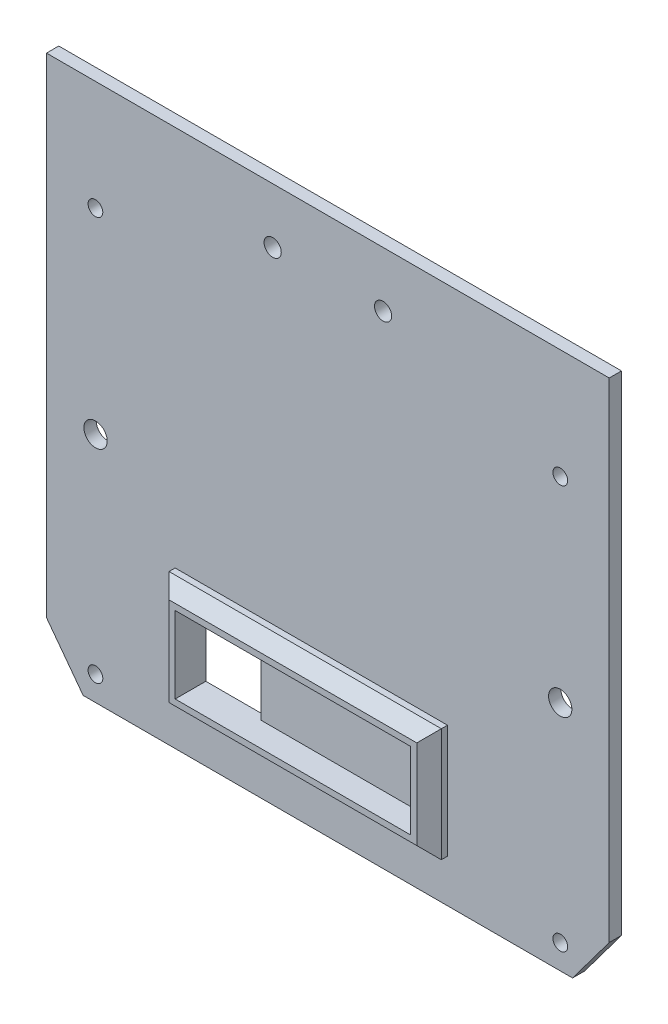
ISO-10303-21;
HEADER;
FILE_DESCRIPTION(('STEP AP214'),'2;1');
FILE_NAME('part.step','',(''),(''),'','','');
FILE_SCHEMA(('AUTOMOTIVE_DESIGN { 1 0 10303 214 1 1 1 1 }'));
ENDSEC;
DATA;
#1=APPLICATION_CONTEXT('core data for automotive mechanical design processes');
#2=APPLICATION_PROTOCOL_DEFINITION('international standard','automotive_design',2000,#1);
#3=PRODUCT_CONTEXT('',#1,'mechanical');
#4=PRODUCT('Part','Part','',(#3));
#5=PRODUCT_RELATED_PRODUCT_CATEGORY('part','',(#4));
#6=PRODUCT_DEFINITION_FORMATION('','',#4);
#7=PRODUCT_DEFINITION_CONTEXT('part definition',#1,'design');
#8=PRODUCT_DEFINITION('design','',#6,#7);
#9=PRODUCT_DEFINITION_SHAPE('','',#8);
#10=(LENGTH_UNIT() NAMED_UNIT(*) SI_UNIT(.MILLI.,.METRE.));
#11=(NAMED_UNIT(*) PLANE_ANGLE_UNIT() SI_UNIT($,.RADIAN.));
#12=(NAMED_UNIT(*) SI_UNIT($,.STERADIAN.) SOLID_ANGLE_UNIT());
#13=UNCERTAINTY_MEASURE_WITH_UNIT(LENGTH_MEASURE(1.E-05),#10,'distance_accuracy_value','');
#14=(GEOMETRIC_REPRESENTATION_CONTEXT(3) GLOBAL_UNCERTAINTY_ASSIGNED_CONTEXT((#13)) GLOBAL_UNIT_ASSIGNED_CONTEXT((#10,
#11,#12)) REPRESENTATION_CONTEXT('',''));
#15=CARTESIAN_POINT('',(0.,0.,0.));
#16=DIRECTION('',(0.,0.,1.));
#17=DIRECTION('',(1.,0.,0.));
#18=AXIS2_PLACEMENT_3D('',#15,#16,#17);
#19=CARTESIAN_POINT('',(0.,0.,1.));
#20=DIRECTION('',(0.,0.,1.));
#21=DIRECTION('',(1.,0.,0.));
#22=AXIS2_PLACEMENT_3D('',#19,#20,#21);
#23=PLANE('',#22);
#24=DIRECTION('',(1.,0.,0.));
#25=VECTOR('',#24,1.);
#26=CARTESIAN_POINT('',(0.,-27.1199999999979,1.));
#27=LINE('',#26,#25);
#28=CARTESIAN_POINT('',(-40.6299999999621,-27.1199999999979,1.));
#29=VERTEX_POINT('',#28);
#30=CARTESIAN_POINT('',(-12.2299999999621,-27.1199999999979,1.));
#31=VERTEX_POINT('',#30);
#32=EDGE_CURVE('E323',#29,#31,#27,.T.);
#33=ORIENTED_EDGE('',*,*,#32,.F.);
#34=DIRECTION('',(0.,-1.,0.));
#35=VECTOR('',#34,1.);
#36=CARTESIAN_POINT('',(-40.6299999999621,0.,1.));
#37=LINE('',#36,#35);
#38=CARTESIAN_POINT('',(-40.6299999999621,-39.6199999999979,1.));
#39=VERTEX_POINT('',#38);
#40=EDGE_CURVE('E300',#29,#39,#37,.T.);
#41=ORIENTED_EDGE('',*,*,#40,.T.);
#42=DIRECTION('',(1.,0.,0.));
#43=VECTOR('',#42,1.);
#44=CARTESIAN_POINT('',(0.,-39.6199999999979,1.));
#45=LINE('',#44,#43);
#46=CARTESIAN_POINT('',(-12.2299999999621,-39.6199999999979,1.));
#47=VERTEX_POINT('',#46);
#48=EDGE_CURVE('E328',#39,#47,#45,.T.);
#49=ORIENTED_EDGE('',*,*,#48,.T.);
#50=DIRECTION('',(0.,-1.,0.));
#51=VECTOR('',#50,1.);
#52=CARTESIAN_POINT('',(-12.2299999999621,0.,1.));
#53=LINE('',#52,#51);
#54=EDGE_CURVE('E331',#31,#47,#53,.T.);
#55=ORIENTED_EDGE('',*,*,#54,.F.);
#56=EDGE_LOOP('',(#33,#41,#49,#55));
#57=FACE_BOUND('',#56,.T.);
#58=ADVANCED_FACE('F47',(#57),#23,.T.);
#59=CARTESIAN_POINT('',(0.,0.,0.));
#60=DIRECTION('',(0.,0.,1.));
#61=DIRECTION('',(1.,0.,0.));
#62=AXIS2_PLACEMENT_3D('',#59,#60,#61);
#63=PLANE('',#62);
#64=CARTESIAN_POINT('',(-66.6099999999618,-11.7463143833101,0.));
#65=DIRECTION('',(0.,0.,-1.));
#66=DIRECTION('',(-1.,0.,0.));
#67=AXIS2_PLACEMENT_3D('',#64,#65,#66);
#68=CIRCLE('',#67,1.89999999999999);
#69=CARTESIAN_POINT('',(-68.5099999999618,-11.7463143833101,0.));
#70=VERTEX_POINT('',#69);
#71=EDGE_CURVE('E430',#70,#70,#68,.T.);
#72=ORIENTED_EDGE('',*,*,#71,.F.);
#73=EDGE_LOOP('',(#72));
#74=FACE_BOUND('',#73,.T.);
#75=CARTESIAN_POINT('',(9.15649160417692,-11.7463143833104,0.));
#76=DIRECTION('',(0.,0.,-1.));
#77=DIRECTION('',(-1.,0.,0.));
#78=AXIS2_PLACEMENT_3D('',#75,#76,#77);
#79=CIRCLE('',#78,1.9);
#80=CARTESIAN_POINT('',(7.25649160417692,-11.7463143833104,0.));
#81=VERTEX_POINT('',#80);
#82=EDGE_CURVE('E435',#81,#81,#79,.T.);
#83=ORIENTED_EDGE('',*,*,#82,.F.);
#84=EDGE_LOOP('',(#83));
#85=FACE_BOUND('',#84,.T.);
#86=DIRECTION('',(-1.,0.,0.));
#87=VECTOR('',#86,1.);
#88=CARTESIAN_POINT('',(1.32185928869475E-13,38.1000000000003,0.));
#89=LINE('',#88,#87);
#90=CARTESIAN_POINT('',(17.1500000000381,38.1000000000003,0.));
#91=VERTEX_POINT('',#90);
#92=CARTESIAN_POINT('',(-74.6099999999618,38.1000000000003,0.));
#93=VERTEX_POINT('',#92);
#94=EDGE_CURVE('E386',#91,#93,#89,.T.);
#95=ORIENTED_EDGE('',*,*,#94,.F.);
#96=DIRECTION('',(0.,1.,0.));
#97=VECTOR('',#96,1.);
#98=CARTESIAN_POINT('',(17.1500000000381,0.,0.));
#99=LINE('',#98,#97);
#100=CARTESIAN_POINT('',(17.1500000000381,-41.6199999999979,0.));
#101=VERTEX_POINT('',#100);
#102=EDGE_CURVE('E220',#101,#91,#99,.T.);
#103=ORIENTED_EDGE('',*,*,#102,.F.);
#104=DIRECTION('',(0.59871769395384,0.800960125690784,0.));
#105=VECTOR('',#104,1.);
#106=CARTESIAN_POINT('',(30.9611910136923,-23.1434902827342,0.));
#107=LINE('',#106,#105);
#108=CARTESIAN_POINT('',(11.1700000000384,-49.6199999999979,0.));
#109=VERTEX_POINT('',#108);
#110=EDGE_CURVE('E216',#109,#101,#107,.T.);
#111=ORIENTED_EDGE('',*,*,#110,.F.);
#112=DIRECTION('',(1.,0.,0.));
#113=VECTOR('',#112,1.);
#114=CARTESIAN_POINT('',(0.,-49.6199999999979,0.));
#115=LINE('',#114,#113);
#116=CARTESIAN_POINT('',(-68.6299999999622,-49.6199999999979,0.));
#117=VERTEX_POINT('',#116);
#118=EDGE_CURVE('E353',#117,#109,#115,.T.);
#119=ORIENTED_EDGE('',*,*,#118,.F.);
#120=DIRECTION('',(-0.598717693953833,0.800960125690789,0.));
#121=VECTOR('',#120,1.);
#122=CARTESIAN_POINT('',(-67.8239140981553,-50.6983757883683,0.));
#123=LINE('',#122,#121);
#124=CARTESIAN_POINT('',(-74.6099999999618,-41.6199999999979,0.));
#125=VERTEX_POINT('',#124);
#126=EDGE_CURVE('E212',#117,#125,#123,.T.);
#127=ORIENTED_EDGE('',*,*,#126,.T.);
#128=DIRECTION('',(0.,1.,0.));
#129=VECTOR('',#128,1.);
#130=CARTESIAN_POINT('',(-74.6099999999618,0.,0.));
#131=LINE('',#130,#129);
#132=EDGE_CURVE('E183',#125,#93,#131,.T.);
#133=ORIENTED_EDGE('',*,*,#132,.T.);
#134=EDGE_LOOP('',(#95,#103,#111,#119,#127,#133));
#135=FACE_BOUND('',#134,.T.);
#136=CARTESIAN_POINT('',(-37.7299999999619,29.1000000000005,0.));
#137=DIRECTION('',(0.,0.,1.));
#138=DIRECTION('',(1.,0.,0.));
#139=AXIS2_PLACEMENT_3D('',#136,#137,#138);
#140=CIRCLE('',#139,1.4);
#141=CARTESIAN_POINT('',(-36.3299999999619,29.1000000000005,0.));
#142=VERTEX_POINT('',#141);
#143=EDGE_CURVE('E250',#142,#142,#140,.T.);
#144=ORIENTED_EDGE('',*,*,#143,.T.);
#145=EDGE_LOOP('',(#144));
#146=FACE_BOUND('',#145,.T.);
#147=CARTESIAN_POINT('',(-19.7299999999619,29.1000000000005,0.));
#148=DIRECTION('',(0.,0.,1.));
#149=DIRECTION('',(1.,0.,0.));
#150=AXIS2_PLACEMENT_3D('',#147,#148,#149);
#151=CIRCLE('',#150,1.4);
#152=CARTESIAN_POINT('',(-18.3299999999619,29.1000000000005,0.));
#153=VERTEX_POINT('',#152);
#154=EDGE_CURVE('E243',#153,#153,#151,.T.);
#155=ORIENTED_EDGE('',*,*,#154,.T.);
#156=EDGE_LOOP('',(#155));
#157=FACE_BOUND('',#156,.T.);
#158=CARTESIAN_POINT('',(-66.629999999962,-45.6199999999979,0.));
#159=DIRECTION('',(0.,0.,1.));
#160=DIRECTION('',(1.,0.,0.));
#161=AXIS2_PLACEMENT_3D('',#158,#159,#160);
#162=CIRCLE('',#161,1.2);
#163=CARTESIAN_POINT('',(-65.429999999962,-45.6199999999979,0.));
#164=VERTEX_POINT('',#163);
#165=EDGE_CURVE('E382',#164,#164,#162,.T.);
#166=ORIENTED_EDGE('',*,*,#165,.T.);
#167=EDGE_LOOP('',(#166));
#168=FACE_BOUND('',#167,.T.);
#169=CARTESIAN_POINT('',(-66.6299999999622,20.2,0.));
#170=DIRECTION('',(0.,0.,1.));
#171=DIRECTION('',(1.,0.,0.));
#172=AXIS2_PLACEMENT_3D('',#169,#170,#171);
#173=CIRCLE('',#172,1.2);
#174=CARTESIAN_POINT('',(-65.4299999999622,20.2,0.));
#175=VERTEX_POINT('',#174);
#176=EDGE_CURVE('E378',#175,#175,#173,.T.);
#177=ORIENTED_EDGE('',*,*,#176,.T.);
#178=EDGE_LOOP('',(#177));
#179=FACE_BOUND('',#178,.T.);
#180=CARTESIAN_POINT('',(9.17000000003836,20.2,0.));
#181=DIRECTION('',(0.,0.,1.));
#182=DIRECTION('',(1.,0.,0.));
#183=AXIS2_PLACEMENT_3D('',#180,#181,#182);
#184=CIRCLE('',#183,1.2);
#185=CARTESIAN_POINT('',(10.3700000000384,20.2,0.));
#186=VERTEX_POINT('',#185);
#187=EDGE_CURVE('E374',#186,#186,#184,.T.);
#188=ORIENTED_EDGE('',*,*,#187,.T.);
#189=EDGE_LOOP('',(#188));
#190=FACE_BOUND('',#189,.T.);
#191=CARTESIAN_POINT('',(9.17000000003823,-45.6199999999979,0.));
#192=DIRECTION('',(0.,0.,1.));
#193=DIRECTION('',(1.,0.,0.));
#194=AXIS2_PLACEMENT_3D('',#191,#192,#193);
#195=CIRCLE('',#194,1.2);
#196=CARTESIAN_POINT('',(10.3700000000382,-45.6199999999979,0.));
#197=VERTEX_POINT('',#196);
#198=EDGE_CURVE('E339',#197,#197,#195,.T.);
#199=ORIENTED_EDGE('',*,*,#198,.T.);
#200=EDGE_LOOP('',(#199));
#201=FACE_BOUND('',#200,.T.);
#202=DIRECTION('',(0.,-1.,0.));
#203=VECTOR('',#202,1.);
#204=CARTESIAN_POINT('',(-40.6299999999621,0.,0.));
#205=LINE('',#204,#203);
#206=CARTESIAN_POINT('',(-40.6299999999621,-27.1199999999979,0.));
#207=VERTEX_POINT('',#206);
#208=CARTESIAN_POINT('',(-40.6299999999621,-39.6199999999979,0.));
#209=VERTEX_POINT('',#208);
#210=EDGE_CURVE('E301',#207,#209,#205,.T.);
#211=ORIENTED_EDGE('',*,*,#210,.F.);
#212=DIRECTION('',(-1.,0.,0.));
#213=VECTOR('',#212,1.);
#214=CARTESIAN_POINT('',(0.,-27.1199999999979,0.));
#215=LINE('',#214,#213);
#216=CARTESIAN_POINT('',(-50.6299999999621,-27.1199999999979,0.));
#217=VERTEX_POINT('',#216);
#218=EDGE_CURVE('E304',#207,#217,#215,.T.);
#219=ORIENTED_EDGE('',*,*,#218,.T.);
#220=DIRECTION('',(0.,-1.,0.));
#221=VECTOR('',#220,1.);
#222=CARTESIAN_POINT('',(-50.6299999999621,0.,0.));
#223=LINE('',#222,#221);
#224=CARTESIAN_POINT('',(-50.6299999999621,-39.6199999999979,0.));
#225=VERTEX_POINT('',#224);
#226=EDGE_CURVE('E308',#217,#225,#223,.T.);
#227=ORIENTED_EDGE('',*,*,#226,.T.);
#228=DIRECTION('',(1.,0.,0.));
#229=VECTOR('',#228,1.);
#230=CARTESIAN_POINT('',(0.,-39.6199999999979,0.));
#231=LINE('',#230,#229);
#232=EDGE_CURVE('E312',#225,#209,#231,.T.);
#233=ORIENTED_EDGE('',*,*,#232,.T.);
#234=EDGE_LOOP('',(#211,#219,#227,#233));
#235=FACE_BOUND('',#234,.T.);
#236=ADVANCED_FACE('F445',(#74,#85,#135,#146,#157,#168,#179,#190,#201,#235),#63,.F.);
#237=CARTESIAN_POINT('',(0.,0.,2.));
#238=DIRECTION('',(0.,0.,1.));
#239=DIRECTION('',(1.,0.,0.));
#240=AXIS2_PLACEMENT_3D('',#237,#238,#239);
#241=PLANE('',#240);
#242=CARTESIAN_POINT('',(-66.6099999999618,-11.7463143833101,2.));
#243=DIRECTION('',(0.,0.,1.));
#244=DIRECTION('',(1.,0.,0.));
#245=AXIS2_PLACEMENT_3D('',#242,#243,#244);
#246=CIRCLE('',#245,1.89999999999999);
#247=CARTESIAN_POINT('',(-64.7099999999618,-11.7463143833101,2.));
#248=VERTEX_POINT('',#247);
#249=EDGE_CURVE('E52',#248,#248,#246,.T.);
#250=ORIENTED_EDGE('',*,*,#249,.F.);
#251=EDGE_LOOP('',(#250));
#252=FACE_BOUND('',#251,.T.);
#253=CARTESIAN_POINT('',(9.15649160417692,-11.7463143833104,2.));
#254=DIRECTION('',(0.,0.,1.));
#255=DIRECTION('',(1.,0.,0.));
#256=AXIS2_PLACEMENT_3D('',#253,#254,#255);
#257=CIRCLE('',#256,1.9);
#258=CARTESIAN_POINT('',(11.0564916041769,-11.7463143833104,2.));
#259=VERTEX_POINT('',#258);
#260=EDGE_CURVE('E206',#259,#259,#257,.T.);
#261=ORIENTED_EDGE('',*,*,#260,.F.);
#262=EDGE_LOOP('',(#261));
#263=FACE_BOUND('',#262,.T.);
#264=DIRECTION('',(0.,-1.,0.));
#265=VECTOR('',#264,1.);
#266=CARTESIAN_POINT('',(17.1500000000381,0.,2.));
#267=LINE('',#266,#265);
#268=CARTESIAN_POINT('',(17.1500000000381,38.1000000000003,2.));
#269=VERTEX_POINT('',#268);
#270=CARTESIAN_POINT('',(17.1500000000381,-41.6199999999979,2.));
#271=VERTEX_POINT('',#270);
#272=EDGE_CURVE('E215',#269,#271,#267,.T.);
#273=ORIENTED_EDGE('',*,*,#272,.F.);
#274=DIRECTION('',(-1.,0.,0.));
#275=VECTOR('',#274,1.);
#276=CARTESIAN_POINT('',(1.32185928869475E-13,38.1000000000003,2.));
#277=LINE('',#276,#275);
#278=CARTESIAN_POINT('',(-74.6099999999618,38.1000000000003,2.));
#279=VERTEX_POINT('',#278);
#280=EDGE_CURVE('E200',#269,#279,#277,.T.);
#281=ORIENTED_EDGE('',*,*,#280,.T.);
#282=DIRECTION('',(0.,-1.,0.));
#283=VECTOR('',#282,1.);
#284=CARTESIAN_POINT('',(-74.6099999999618,0.,2.));
#285=LINE('',#284,#283);
#286=CARTESIAN_POINT('',(-74.6099999999618,-41.6199999999979,2.));
#287=VERTEX_POINT('',#286);
#288=EDGE_CURVE('E181',#279,#287,#285,.T.);
#289=ORIENTED_EDGE('',*,*,#288,.T.);
#290=DIRECTION('',(0.598717693953833,-0.800960125690789,0.));
#291=VECTOR('',#290,1.);
#292=CARTESIAN_POINT('',(-67.8239140981553,-50.6983757883683,2.));
#293=LINE('',#292,#291);
#294=CARTESIAN_POINT('',(-68.6299999999622,-49.6199999999979,2.));
#295=VERTEX_POINT('',#294);
#296=EDGE_CURVE('E187',#287,#295,#293,.T.);
#297=ORIENTED_EDGE('',*,*,#296,.T.);
#298=DIRECTION('',(1.,0.,0.));
#299=VECTOR('',#298,1.);
#300=CARTESIAN_POINT('',(0.,-49.6199999999979,2.));
#301=LINE('',#300,#299);
#302=CARTESIAN_POINT('',(11.1700000000384,-49.6199999999979,2.));
#303=VERTEX_POINT('',#302);
#304=EDGE_CURVE('E367',#295,#303,#301,.T.);
#305=ORIENTED_EDGE('',*,*,#304,.T.);
#306=DIRECTION('',(-0.59871769395384,-0.800960125690784,0.));
#307=VECTOR('',#306,1.);
#308=CARTESIAN_POINT('',(30.9611910136923,-23.1434902827342,2.));
#309=LINE('',#308,#307);
#310=EDGE_CURVE('E229',#271,#303,#309,.T.);
#311=ORIENTED_EDGE('',*,*,#310,.F.);
#312=EDGE_LOOP('',(#273,#281,#289,#297,#305,#311));
#313=FACE_BOUND('',#312,.T.);
#314=CARTESIAN_POINT('',(-37.7299999999619,29.1000000000005,2.));
#315=DIRECTION('',(0.,0.,1.));
#316=DIRECTION('',(1.,0.,0.));
#317=AXIS2_PLACEMENT_3D('',#314,#315,#316);
#318=CIRCLE('',#317,1.4);
#319=CARTESIAN_POINT('',(-36.3299999999619,29.1000000000005,2.));
#320=VERTEX_POINT('',#319);
#321=EDGE_CURVE('E239',#320,#320,#318,.T.);
#322=ORIENTED_EDGE('',*,*,#321,.F.);
#323=EDGE_LOOP('',(#322));
#324=FACE_BOUND('',#323,.T.);
#325=CARTESIAN_POINT('',(-19.7299999999619,29.1000000000005,2.));
#326=DIRECTION('',(0.,0.,1.));
#327=DIRECTION('',(1.,0.,0.));
#328=AXIS2_PLACEMENT_3D('',#325,#326,#327);
#329=CIRCLE('',#328,1.4);
#330=CARTESIAN_POINT('',(-18.3299999999619,29.1000000000005,2.));
#331=VERTEX_POINT('',#330);
#332=EDGE_CURVE('E225',#331,#331,#329,.T.);
#333=ORIENTED_EDGE('',*,*,#332,.F.);
#334=EDGE_LOOP('',(#333));
#335=FACE_BOUND('',#334,.T.);
#336=DIRECTION('',(1.,0.,0.));
#337=VECTOR('',#336,1.);
#338=CARTESIAN_POINT('',(0.,-24.1199999999979,2.));
#339=LINE('',#338,#337);
#340=CARTESIAN_POINT('',(-53.6299999999621,-24.1199999999979,2.));
#341=VERTEX_POINT('',#340);
#342=CARTESIAN_POINT('',(-9.22999999996214,-24.1199999999979,2.));
#343=VERTEX_POINT('',#342);
#344=EDGE_CURVE('E273',#341,#343,#339,.T.);
#345=ORIENTED_EDGE('',*,*,#344,.T.);
#346=DIRECTION('',(0.,-1.,0.));
#347=VECTOR('',#346,1.);
#348=CARTESIAN_POINT('',(-9.22999999996214,0.,2.));
#349=LINE('',#348,#347);
#350=CARTESIAN_POINT('',(-9.22999999996214,-42.6199999999979,2.));
#351=VERTEX_POINT('',#350);
#352=EDGE_CURVE('E260',#343,#351,#349,.T.);
#353=ORIENTED_EDGE('',*,*,#352,.T.);
#354=DIRECTION('',(1.,0.,0.));
#355=VECTOR('',#354,1.);
#356=CARTESIAN_POINT('',(0.,-42.6199999999979,2.));
#357=LINE('',#356,#355);
#358=CARTESIAN_POINT('',(-53.6299999999621,-42.6199999999979,2.));
#359=VERTEX_POINT('',#358);
#360=EDGE_CURVE('E282',#359,#351,#357,.T.);
#361=ORIENTED_EDGE('',*,*,#360,.F.);
#362=DIRECTION('',(0.,-1.,0.));
#363=VECTOR('',#362,1.);
#364=CARTESIAN_POINT('',(-53.6299999999621,0.,2.));
#365=LINE('',#364,#363);
#366=EDGE_CURVE('E277',#341,#359,#365,.T.);
#367=ORIENTED_EDGE('',*,*,#366,.F.);
#368=EDGE_LOOP('',(#345,#353,#361,#367));
#369=FACE_BOUND('',#368,.T.);
#370=CARTESIAN_POINT('',(9.17000000003823,-45.6199999999979,2.));
#371=DIRECTION('',(0.,0.,1.));
#372=DIRECTION('',(1.,0.,0.));
#373=AXIS2_PLACEMENT_3D('',#370,#371,#372);
#374=CIRCLE('',#373,1.2);
#375=CARTESIAN_POINT('',(10.3700000000382,-45.6199999999979,2.));
#376=VERTEX_POINT('',#375);
#377=EDGE_CURVE('E348',#376,#376,#374,.T.);
#378=ORIENTED_EDGE('',*,*,#377,.F.);
#379=EDGE_LOOP('',(#378));
#380=FACE_BOUND('',#379,.T.);
#381=CARTESIAN_POINT('',(9.17000000003836,20.2,2.));
#382=DIRECTION('',(0.,0.,1.));
#383=DIRECTION('',(1.,0.,0.));
#384=AXIS2_PLACEMENT_3D('',#381,#382,#383);
#385=CIRCLE('',#384,1.2);
#386=CARTESIAN_POINT('',(10.3700000000384,20.2,2.));
#387=VERTEX_POINT('',#386);
#388=EDGE_CURVE('E352',#387,#387,#385,.T.);
#389=ORIENTED_EDGE('',*,*,#388,.F.);
#390=EDGE_LOOP('',(#389));
#391=FACE_BOUND('',#390,.T.);
#392=CARTESIAN_POINT('',(-66.6299999999622,20.2,2.));
#393=DIRECTION('',(0.,0.,1.));
#394=DIRECTION('',(1.,0.,0.));
#395=AXIS2_PLACEMENT_3D('',#392,#393,#394);
#396=CIRCLE('',#395,1.2);
#397=CARTESIAN_POINT('',(-65.4299999999622,20.2,2.));
#398=VERTEX_POINT('',#397);
#399=EDGE_CURVE('E357',#398,#398,#396,.T.);
#400=ORIENTED_EDGE('',*,*,#399,.F.);
#401=EDGE_LOOP('',(#400));
#402=FACE_BOUND('',#401,.T.);
#403=CARTESIAN_POINT('',(-66.629999999962,-45.6199999999979,2.));
#404=DIRECTION('',(0.,0.,1.));
#405=DIRECTION('',(1.,0.,0.));
#406=AXIS2_PLACEMENT_3D('',#403,#404,#405);
#407=CIRCLE('',#406,1.2);
#408=CARTESIAN_POINT('',(-65.429999999962,-45.6199999999979,2.));
#409=VERTEX_POINT('',#408);
#410=EDGE_CURVE('E361',#409,#409,#407,.T.);
#411=ORIENTED_EDGE('',*,*,#410,.F.);
#412=EDGE_LOOP('',(#411));
#413=FACE_BOUND('',#412,.T.);
#414=ADVANCED_FACE('F198',(#252,#263,#313,#324,#335,#369,#380,#391,#402,#413),#241,.T.);
#415=CARTESIAN_POINT('',(1.32185928869475E-13,38.1000000000003,2.));
#416=DIRECTION('',(0.,-1.,0.));
#417=DIRECTION('',(1.,0.,0.));
#418=AXIS2_PLACEMENT_3D('',#415,#416,#417);
#419=PLANE('',#418);
#420=ORIENTED_EDGE('',*,*,#94,.T.);
#421=DIRECTION('',(0.,0.,1.));
#422=VECTOR('',#421,1.);
#423=CARTESIAN_POINT('',(-74.6099999999618,38.1000000000003,-88.2858924177567));
#424=LINE('',#423,#422);
#425=EDGE_CURVE('E186',#93,#279,#424,.T.);
#426=ORIENTED_EDGE('',*,*,#425,.T.);
#427=ORIENTED_EDGE('',*,*,#280,.F.);
#428=DIRECTION('',(0.,0.,1.));
#429=VECTOR('',#428,1.);
#430=CARTESIAN_POINT('',(17.1500000000381,38.1000000000003,-88.2858924177567));
#431=LINE('',#430,#429);
#432=EDGE_CURVE('E233',#91,#269,#431,.T.);
#433=ORIENTED_EDGE('',*,*,#432,.F.);
#434=EDGE_LOOP('',(#420,#426,#427,#433));
#435=FACE_BOUND('',#434,.T.);
#436=ADVANCED_FACE('F521',(#435),#419,.F.);
#437=CARTESIAN_POINT('',(0.,-49.6199999999979,2.));
#438=DIRECTION('',(0.,1.,0.));
#439=DIRECTION('',(0.,0.,1.));
#440=AXIS2_PLACEMENT_3D('',#437,#438,#439);
#441=PLANE('',#440);
#442=ORIENTED_EDGE('',*,*,#118,.T.);
#443=DIRECTION('',(0.,0.,-1.));
#444=VECTOR('',#443,1.);
#445=CARTESIAN_POINT('',(11.1700000000384,-49.6199999999979,2.));
#446=LINE('',#445,#444);
#447=EDGE_CURVE('E370',#303,#109,#446,.T.);
#448=ORIENTED_EDGE('',*,*,#447,.F.);
#449=ORIENTED_EDGE('',*,*,#304,.F.);
#450=DIRECTION('',(0.,0.,-1.));
#451=VECTOR('',#450,1.);
#452=CARTESIAN_POINT('',(-68.6299999999622,-49.6199999999979,2.));
#453=LINE('',#452,#451);
#454=EDGE_CURVE('E192',#295,#117,#453,.T.);
#455=ORIENTED_EDGE('',*,*,#454,.T.);
#456=EDGE_LOOP('',(#442,#448,#449,#455));
#457=FACE_BOUND('',#456,.T.);
#458=ADVANCED_FACE('F524',(#457),#441,.F.);
#459=CARTESIAN_POINT('',(-66.629999999962,-45.6199999999979,2.));
#460=DIRECTION('',(0.,0.,-1.));
#461=DIRECTION('',(-1.,0.,0.));
#462=AXIS2_PLACEMENT_3D('',#459,#460,#461);
#463=CYLINDRICAL_SURFACE('',#462,1.2);
#464=ORIENTED_EDGE('',*,*,#410,.T.);
#465=EDGE_LOOP('',(#464));
#466=FACE_BOUND('',#465,.T.);
#467=ORIENTED_EDGE('',*,*,#165,.F.);
#468=EDGE_LOOP('',(#467));
#469=FACE_BOUND('',#468,.T.);
#470=ADVANCED_FACE('F527',(#466,#469),#463,.F.);
#471=CARTESIAN_POINT('',(-66.6299999999622,20.2,2.));
#472=DIRECTION('',(0.,0.,-1.));
#473=DIRECTION('',(-1.,0.,0.));
#474=AXIS2_PLACEMENT_3D('',#471,#472,#473);
#475=CYLINDRICAL_SURFACE('',#474,1.2);
#476=ORIENTED_EDGE('',*,*,#399,.T.);
#477=EDGE_LOOP('',(#476));
#478=FACE_BOUND('',#477,.T.);
#479=ORIENTED_EDGE('',*,*,#176,.F.);
#480=EDGE_LOOP('',(#479));
#481=FACE_BOUND('',#480,.T.);
#482=ADVANCED_FACE('F534',(#478,#481),#475,.F.);
#483=CARTESIAN_POINT('',(9.17000000003836,20.2,2.));
#484=DIRECTION('',(0.,0.,-1.));
#485=DIRECTION('',(-1.,0.,0.));
#486=AXIS2_PLACEMENT_3D('',#483,#484,#485);
#487=CYLINDRICAL_SURFACE('',#486,1.2);
#488=ORIENTED_EDGE('',*,*,#388,.T.);
#489=EDGE_LOOP('',(#488));
#490=FACE_BOUND('',#489,.T.);
#491=ORIENTED_EDGE('',*,*,#187,.F.);
#492=EDGE_LOOP('',(#491));
#493=FACE_BOUND('',#492,.T.);
#494=ADVANCED_FACE('F516',(#490,#493),#487,.F.);
#495=CARTESIAN_POINT('',(9.17000000003823,-45.6199999999979,2.));
#496=DIRECTION('',(0.,0.,-1.));
#497=DIRECTION('',(-1.,0.,0.));
#498=AXIS2_PLACEMENT_3D('',#495,#496,#497);
#499=CYLINDRICAL_SURFACE('',#498,1.2);
#500=ORIENTED_EDGE('',*,*,#377,.T.);
#501=EDGE_LOOP('',(#500));
#502=FACE_BOUND('',#501,.T.);
#503=ORIENTED_EDGE('',*,*,#198,.F.);
#504=EDGE_LOOP('',(#503));
#505=FACE_BOUND('',#504,.T.);
#506=ADVANCED_FACE('F512',(#502,#505),#499,.F.);
#507=CARTESIAN_POINT('',(0.,-27.1199999999979,1.));
#508=DIRECTION('',(0.,-1.,0.));
#509=DIRECTION('',(0.,0.,-1.));
#510=AXIS2_PLACEMENT_3D('',#507,#508,#509);
#511=PLANE('',#510);
#512=DIRECTION('',(0.,0.,1.));
#513=VECTOR('',#512,1.);
#514=CARTESIAN_POINT('',(-12.2299999999621,-27.1199999999979,1.));
#515=LINE('',#514,#513);
#516=CARTESIAN_POINT('',(-12.2299999999621,-27.1199999999979,5.));
#517=VERTEX_POINT('',#516);
#518=EDGE_CURVE('E336',#31,#517,#515,.T.);
#519=ORIENTED_EDGE('',*,*,#518,.T.);
#520=DIRECTION('',(1.,0.,0.));
#521=VECTOR('',#520,1.);
#522=CARTESIAN_POINT('',(0.,-27.1199999999979,5.));
#523=LINE('',#522,#521);
#524=CARTESIAN_POINT('',(-50.6299999999621,-27.1199999999979,5.));
#525=VERTEX_POINT('',#524);
#526=EDGE_CURVE('E264',#525,#517,#523,.T.);
#527=ORIENTED_EDGE('',*,*,#526,.F.);
#528=DIRECTION('',(0.,0.,1.));
#529=VECTOR('',#528,1.);
#530=CARTESIAN_POINT('',(-50.6299999999621,-27.1199999999979,1.));
#531=LINE('',#530,#529);
#532=EDGE_CURVE('E335',#217,#525,#531,.T.);
#533=ORIENTED_EDGE('',*,*,#532,.F.);
#534=ORIENTED_EDGE('',*,*,#218,.F.);
#535=DIRECTION('',(0.,0.,1.));
#536=VECTOR('',#535,1.);
#537=CARTESIAN_POINT('',(-40.6299999999621,-27.1199999999979,0.));
#538=LINE('',#537,#536);
#539=EDGE_CURVE('E316',#207,#29,#538,.T.);
#540=ORIENTED_EDGE('',*,*,#539,.T.);
#541=ORIENTED_EDGE('',*,*,#32,.T.);
#542=EDGE_LOOP('',(#519,#527,#533,#534,#540,#541));
#543=FACE_BOUND('',#542,.T.);
#544=ADVANCED_FACE('F484',(#543),#511,.T.);
#545=CARTESIAN_POINT('',(-12.2299999999621,0.,1.));
#546=DIRECTION('',(-1.,0.,0.));
#547=DIRECTION('',(0.,0.,1.));
#548=AXIS2_PLACEMENT_3D('',#545,#546,#547);
#549=PLANE('',#548);
#550=DIRECTION('',(0.,0.,1.));
#551=VECTOR('',#550,1.);
#552=CARTESIAN_POINT('',(-12.2299999999621,-39.6199999999979,1.));
#553=LINE('',#552,#551);
#554=CARTESIAN_POINT('',(-12.2299999999621,-39.6199999999979,5.));
#555=VERTEX_POINT('',#554);
#556=EDGE_CURVE('E340',#47,#555,#553,.T.);
#557=ORIENTED_EDGE('',*,*,#556,.T.);
#558=DIRECTION('',(0.,-1.,0.));
#559=VECTOR('',#558,1.);
#560=CARTESIAN_POINT('',(-12.2299999999621,0.,5.));
#561=LINE('',#560,#559);
#562=EDGE_CURVE('E268',#517,#555,#561,.T.);
#563=ORIENTED_EDGE('',*,*,#562,.F.);
#564=ORIENTED_EDGE('',*,*,#518,.F.);
#565=ORIENTED_EDGE('',*,*,#54,.T.);
#566=EDGE_LOOP('',(#557,#563,#564,#565));
#567=FACE_BOUND('',#566,.T.);
#568=ADVANCED_FACE('F480',(#567),#549,.T.);
#569=CARTESIAN_POINT('',(0.,-39.6199999999979,1.));
#570=DIRECTION('',(0.,-1.,0.));
#571=DIRECTION('',(0.,0.,-1.));
#572=AXIS2_PLACEMENT_3D('',#569,#570,#571);
#573=PLANE('',#572);
#574=DIRECTION('',(0.,0.,1.));
#575=VECTOR('',#574,1.);
#576=CARTESIAN_POINT('',(-50.6299999999621,-39.6199999999979,1.));
#577=LINE('',#576,#575);
#578=CARTESIAN_POINT('',(-50.6299999999621,-39.6199999999979,5.));
#579=VERTEX_POINT('',#578);
#580=EDGE_CURVE('E343',#225,#579,#577,.T.);
#581=ORIENTED_EDGE('',*,*,#580,.T.);
#582=DIRECTION('',(-1.,0.,0.));
#583=VECTOR('',#582,1.);
#584=CARTESIAN_POINT('',(0.,-39.6199999999979,5.));
#585=LINE('',#584,#583);
#586=EDGE_CURVE('E255',#555,#579,#585,.T.);
#587=ORIENTED_EDGE('',*,*,#586,.F.);
#588=ORIENTED_EDGE('',*,*,#556,.F.);
#589=ORIENTED_EDGE('',*,*,#48,.F.);
#590=DIRECTION('',(0.,0.,1.));
#591=VECTOR('',#590,1.);
#592=CARTESIAN_POINT('',(-40.6299999999621,-39.6199999999979,0.));
#593=LINE('',#592,#591);
#594=EDGE_CURVE('E320',#209,#39,#593,.T.);
#595=ORIENTED_EDGE('',*,*,#594,.F.);
#596=ORIENTED_EDGE('',*,*,#232,.F.);
#597=EDGE_LOOP('',(#581,#587,#588,#589,#595,#596));
#598=FACE_BOUND('',#597,.T.);
#599=ADVANCED_FACE('F472',(#598),#573,.F.);
#600=CARTESIAN_POINT('',(-50.6299999999621,0.,1.));
#601=DIRECTION('',(-1.,0.,0.));
#602=DIRECTION('',(0.,0.,1.));
#603=AXIS2_PLACEMENT_3D('',#600,#601,#602);
#604=PLANE('',#603);
#605=ORIENTED_EDGE('',*,*,#532,.T.);
#606=DIRECTION('',(0.,1.,0.));
#607=VECTOR('',#606,1.);
#608=CARTESIAN_POINT('',(-50.6299999999621,0.,5.));
#609=LINE('',#608,#607);
#610=EDGE_CURVE('E259',#579,#525,#609,.T.);
#611=ORIENTED_EDGE('',*,*,#610,.F.);
#612=ORIENTED_EDGE('',*,*,#580,.F.);
#613=ORIENTED_EDGE('',*,*,#226,.F.);
#614=EDGE_LOOP('',(#605,#611,#612,#613));
#615=FACE_BOUND('',#614,.T.);
#616=ADVANCED_FACE('F489',(#615),#604,.F.);
#617=CARTESIAN_POINT('',(-40.6299999999621,0.,0.));
#618=DIRECTION('',(-1.,0.,0.));
#619=DIRECTION('',(0.,0.,1.));
#620=AXIS2_PLACEMENT_3D('',#617,#618,#619);
#621=PLANE('',#620);
#622=ORIENTED_EDGE('',*,*,#40,.F.);
#623=ORIENTED_EDGE('',*,*,#539,.F.);
#624=ORIENTED_EDGE('',*,*,#210,.T.);
#625=ORIENTED_EDGE('',*,*,#594,.T.);
#626=EDGE_LOOP('',(#622,#623,#624,#625));
#627=FACE_BOUND('',#626,.T.);
#628=ADVANCED_FACE('F469',(#627),#621,.T.);
#629=CARTESIAN_POINT('',(0.,-24.1199999999979,5.));
#630=DIRECTION('',(0.,1.,0.));
#631=DIRECTION('',(0.,0.,1.));
#632=AXIS2_PLACEMENT_3D('',#629,#630,#631);
#633=PLANE('',#632);
#634=DIRECTION('',(0.,0.,-1.));
#635=VECTOR('',#634,1.);
#636=CARTESIAN_POINT('',(-53.6299999999621,-24.1199999999979,5.));
#637=LINE('',#636,#635);
#638=CARTESIAN_POINT('',(-53.6299999999621,-24.1199999999979,2.99999999999998));
#639=VERTEX_POINT('',#638);
#640=EDGE_CURVE('E297',#639,#341,#637,.T.);
#641=ORIENTED_EDGE('',*,*,#640,.F.);
#642=DIRECTION('',(1.,0.,0.));
#643=VECTOR('',#642,1.);
#644=CARTESIAN_POINT('',(0.,-24.1199999999979,2.99999999999998));
#645=LINE('',#644,#643);
#646=CARTESIAN_POINT('',(-9.22999999996214,-24.1199999999979,2.99999999999998));
#647=VERTEX_POINT('',#646);
#648=EDGE_CURVE('E396',#639,#647,#645,.T.);
#649=ORIENTED_EDGE('',*,*,#648,.T.);
#650=DIRECTION('',(0.,0.,-1.));
#651=VECTOR('',#650,1.);
#652=CARTESIAN_POINT('',(-9.22999999996214,-24.1199999999979,5.));
#653=LINE('',#652,#651);
#654=EDGE_CURVE('E272',#647,#343,#653,.T.);
#655=ORIENTED_EDGE('',*,*,#654,.T.);
#656=ORIENTED_EDGE('',*,*,#344,.F.);
#657=EDGE_LOOP('',(#641,#649,#655,#656));
#658=FACE_BOUND('',#657,.T.);
#659=ADVANCED_FACE('F497',(#658),#633,.T.);
#660=CARTESIAN_POINT('',(-53.6299999999621,0.,5.));
#661=DIRECTION('',(1.,0.,0.));
#662=DIRECTION('',(0.,0.,-1.));
#663=AXIS2_PLACEMENT_3D('',#660,#661,#662);
#664=PLANE('',#663);
#665=DIRECTION('',(0.,0.,-1.));
#666=VECTOR('',#665,1.);
#667=CARTESIAN_POINT('',(-53.6299999999621,-42.6199999999979,5.));
#668=LINE('',#667,#666);
#669=CARTESIAN_POINT('',(-53.6299999999621,-42.6199999999979,2.99999999999998));
#670=VERTEX_POINT('',#669);
#671=EDGE_CURVE('E294',#670,#359,#668,.T.);
#672=ORIENTED_EDGE('',*,*,#671,.F.);
#673=DIRECTION('',(0.,1.,0.));
#674=VECTOR('',#673,1.);
#675=CARTESIAN_POINT('',(-53.6299999999621,-24.1199999999979,2.99999999999998));
#676=LINE('',#675,#674);
#677=EDGE_CURVE('E11',#670,#639,#676,.T.);
#678=ORIENTED_EDGE('',*,*,#677,.T.);
#679=ORIENTED_EDGE('',*,*,#640,.T.);
#680=ORIENTED_EDGE('',*,*,#366,.T.);
#681=EDGE_LOOP('',(#672,#678,#679,#680));
#682=FACE_BOUND('',#681,.T.);
#683=ADVANCED_FACE('F588',(#682),#664,.F.);
#684=CARTESIAN_POINT('',(0.,-42.6199999999979,5.));
#685=DIRECTION('',(0.,1.,0.));
#686=DIRECTION('',(0.,0.,1.));
#687=AXIS2_PLACEMENT_3D('',#684,#685,#686);
#688=PLANE('',#687);
#689=DIRECTION('',(0.,0.,-1.));
#690=VECTOR('',#689,1.);
#691=CARTESIAN_POINT('',(-9.22999999996214,-42.6199999999979,5.));
#692=LINE('',#691,#690);
#693=CARTESIAN_POINT('',(-9.22999999996214,-42.6199999999979,2.99999999999998));
#694=VERTEX_POINT('',#693);
#695=EDGE_CURVE('E291',#694,#351,#692,.T.);
#696=ORIENTED_EDGE('',*,*,#695,.F.);
#697=DIRECTION('',(-1.,0.,0.));
#698=VECTOR('',#697,1.);
#699=CARTESIAN_POINT('',(-53.6299999999621,-42.6199999999979,2.99999999999998));
#700=LINE('',#699,#698);
#701=EDGE_CURVE('E58',#694,#670,#700,.T.);
#702=ORIENTED_EDGE('',*,*,#701,.T.);
#703=ORIENTED_EDGE('',*,*,#671,.T.);
#704=ORIENTED_EDGE('',*,*,#360,.T.);
#705=EDGE_LOOP('',(#696,#702,#703,#704));
#706=FACE_BOUND('',#705,.T.);
#707=ADVANCED_FACE('F586',(#706),#688,.F.);
#708=CARTESIAN_POINT('',(-9.22999999996214,0.,5.));
#709=DIRECTION('',(1.,0.,0.));
#710=DIRECTION('',(0.,1.,0.));
#711=AXIS2_PLACEMENT_3D('',#708,#709,#710);
#712=PLANE('',#711);
#713=ORIENTED_EDGE('',*,*,#654,.F.);
#714=DIRECTION('',(0.,-1.,0.));
#715=VECTOR('',#714,1.);
#716=CARTESIAN_POINT('',(-9.22999999996214,0.,2.99999999999998));
#717=LINE('',#716,#715);
#718=EDGE_CURVE('E73',#647,#694,#717,.T.);
#719=ORIENTED_EDGE('',*,*,#718,.T.);
#720=ORIENTED_EDGE('',*,*,#695,.T.);
#721=ORIENTED_EDGE('',*,*,#352,.F.);
#722=EDGE_LOOP('',(#713,#719,#720,#721));
#723=FACE_BOUND('',#722,.T.);
#724=ADVANCED_FACE('F581',(#723),#712,.T.);
#725=CARTESIAN_POINT('',(0.,0.,5.));
#726=DIRECTION('',(0.,0.,1.));
#727=DIRECTION('',(1.,0.,0.));
#728=AXIS2_PLACEMENT_3D('',#725,#726,#727);
#729=PLANE('',#728);
#730=DIRECTION('',(0.,1.,0.));
#731=VECTOR('',#730,1.);
#732=CARTESIAN_POINT('',(-11.2299999999622,0.,5.));
#733=LINE('',#732,#731);
#734=CARTESIAN_POINT('',(-11.2299999999622,-40.6199999999979,5.));
#735=VERTEX_POINT('',#734);
#736=CARTESIAN_POINT('',(-11.2299999999622,-26.1199999999979,5.));
#737=VERTEX_POINT('',#736);
#738=EDGE_CURVE('E406',#735,#737,#733,.T.);
#739=ORIENTED_EDGE('',*,*,#738,.T.);
#740=DIRECTION('',(-1.,0.,0.));
#741=VECTOR('',#740,1.);
#742=CARTESIAN_POINT('',(0.,-26.1199999999979,5.));
#743=LINE('',#742,#741);
#744=CARTESIAN_POINT('',(-51.6299999999621,-26.1199999999979,5.));
#745=VERTEX_POINT('',#744);
#746=EDGE_CURVE('E409',#737,#745,#743,.T.);
#747=ORIENTED_EDGE('',*,*,#746,.T.);
#748=DIRECTION('',(0.,-1.,0.));
#749=VECTOR('',#748,1.);
#750=CARTESIAN_POINT('',(-51.6299999999621,-42.6199999999979,5.));
#751=LINE('',#750,#749);
#752=CARTESIAN_POINT('',(-51.6299999999621,-40.6199999999979,5.));
#753=VERTEX_POINT('',#752);
#754=EDGE_CURVE('E400',#745,#753,#751,.T.);
#755=ORIENTED_EDGE('',*,*,#754,.T.);
#756=DIRECTION('',(1.,0.,0.));
#757=VECTOR('',#756,1.);
#758=CARTESIAN_POINT('',(-9.22999999996214,-40.6199999999979,5.));
#759=LINE('',#758,#757);
#760=EDGE_CURVE('E403',#753,#735,#759,.T.);
#761=ORIENTED_EDGE('',*,*,#760,.T.);
#762=EDGE_LOOP('',(#739,#747,#755,#761));
#763=FACE_BOUND('',#762,.T.);
#764=ORIENTED_EDGE('',*,*,#586,.T.);
#765=ORIENTED_EDGE('',*,*,#610,.T.);
#766=ORIENTED_EDGE('',*,*,#526,.T.);
#767=ORIENTED_EDGE('',*,*,#562,.T.);
#768=EDGE_LOOP('',(#764,#765,#766,#767));
#769=FACE_BOUND('',#768,.T.);
#770=ADVANCED_FACE('F486',(#763,#769),#729,.T.);
#771=CARTESIAN_POINT('',(0.,-40.6199999999979,5.));
#772=DIRECTION('',(0.,-0.707106781186547,0.707106781186547));
#773=DIRECTION('',(-1.,0.,0.));
#774=AXIS2_PLACEMENT_3D('',#771,#772,#773);
#775=PLANE('',#774);
#776=DIRECTION('',(0.577350269189626,-0.577350269189626,-0.577350269189626));
#777=VECTOR('',#776,1.);
#778=CARTESIAN_POINT('',(-7.48666666664143,-44.3633333333186,1.25666666667928));
#779=LINE('',#778,#777);
#780=EDGE_CURVE('E422',#735,#694,#779,.T.);
#781=ORIENTED_EDGE('',*,*,#780,.F.);
#782=ORIENTED_EDGE('',*,*,#760,.F.);
#783=DIRECTION('',(0.577350269189626,0.577350269189626,0.577350269189626));
#784=VECTOR('',#783,1.);
#785=CARTESIAN_POINT('',(-38.0899999999628,-27.0799999999986,18.5399999999993));
#786=LINE('',#785,#784);
#787=EDGE_CURVE('E278',#670,#753,#786,.T.);
#788=ORIENTED_EDGE('',*,*,#787,.F.);
#789=ORIENTED_EDGE('',*,*,#701,.F.);
#790=EDGE_LOOP('',(#781,#782,#788,#789));
#791=FACE_BOUND('',#790,.T.);
#792=ADVANCED_FACE('F50',(#791),#775,.T.);
#793=CARTESIAN_POINT('',(-51.6299999999621,0.,5.));
#794=DIRECTION('',(-0.707106781186547,0.,0.707106781186547));
#795=DIRECTION('',(0.,1.,0.));
#796=AXIS2_PLACEMENT_3D('',#793,#794,#795);
#797=PLANE('',#796);
#798=ORIENTED_EDGE('',*,*,#787,.T.);
#799=ORIENTED_EDGE('',*,*,#754,.F.);
#800=DIRECTION('',(0.577350269189626,-0.577350269189626,0.577350269189626));
#801=VECTOR('',#800,1.);
#802=CARTESIAN_POINT('',(-60.3366666666281,-17.4133333333319,-3.70666666666596));
#803=LINE('',#802,#801);
#804=EDGE_CURVE('E419',#639,#745,#803,.T.);
#805=ORIENTED_EDGE('',*,*,#804,.F.);
#806=ORIENTED_EDGE('',*,*,#677,.F.);
#807=EDGE_LOOP('',(#798,#799,#805,#806));
#808=FACE_BOUND('',#807,.T.);
#809=ADVANCED_FACE('F556',(#808),#797,.T.);
#810=CARTESIAN_POINT('',(-9.22999999996214,0.,2.99999999999998));
#811=DIRECTION('',(-0.707106781186547,0.,-0.707106781186548));
#812=DIRECTION('',(0.,-1.,0.));
#813=AXIS2_PLACEMENT_3D('',#810,#811,#812);
#814=PLANE('',#813);
#815=ORIENTED_EDGE('',*,*,#780,.T.);
#816=ORIENTED_EDGE('',*,*,#718,.F.);
#817=DIRECTION('',(-0.577350269189626,-0.577350269189626,0.577350269189626));
#818=VECTOR('',#817,1.);
#819=CARTESIAN_POINT('',(-1.18999999996284,-16.0799999999986,-5.0399999999993));
#820=LINE('',#819,#818);
#821=EDGE_CURVE('E254',#737,#647,#820,.F.);
#822=ORIENTED_EDGE('',*,*,#821,.F.);
#823=ORIENTED_EDGE('',*,*,#738,.F.);
#824=EDGE_LOOP('',(#815,#816,#822,#823));
#825=FACE_BOUND('',#824,.T.);
#826=ADVANCED_FACE('F550',(#825),#814,.F.);
#827=CARTESIAN_POINT('',(0.,-24.1199999999979,2.99999999999998));
#828=DIRECTION('',(0.,-0.707106781186547,-0.707106781186547));
#829=DIRECTION('',(1.,0.,0.));
#830=AXIS2_PLACEMENT_3D('',#827,#828,#829);
#831=PLANE('',#830);
#832=ORIENTED_EDGE('',*,*,#804,.T.);
#833=ORIENTED_EDGE('',*,*,#746,.F.);
#834=ORIENTED_EDGE('',*,*,#821,.T.);
#835=ORIENTED_EDGE('',*,*,#648,.F.);
#836=EDGE_LOOP('',(#832,#833,#834,#835));
#837=FACE_BOUND('',#836,.T.);
#838=ADVANCED_FACE('F543',(#837),#831,.F.);
#839=CARTESIAN_POINT('',(-19.7299999999619,29.1000000000005,-8.));
#840=DIRECTION('',(0.,0.,1.));
#841=DIRECTION('',(1.,0.,0.));
#842=AXIS2_PLACEMENT_3D('',#839,#840,#841);
#843=CYLINDRICAL_SURFACE('',#842,1.4);
#844=ORIENTED_EDGE('',*,*,#332,.T.);
#845=EDGE_LOOP('',(#844));
#846=FACE_BOUND('',#845,.T.);
#847=ORIENTED_EDGE('',*,*,#154,.F.);
#848=EDGE_LOOP('',(#847));
#849=FACE_BOUND('',#848,.T.);
#850=ADVANCED_FACE('F549',(#846,#849),#843,.F.);
#851=CARTESIAN_POINT('',(-37.7299999999619,29.1000000000005,-8.));
#852=DIRECTION('',(0.,0.,1.));
#853=DIRECTION('',(1.,0.,0.));
#854=AXIS2_PLACEMENT_3D('',#851,#852,#853);
#855=CYLINDRICAL_SURFACE('',#854,1.4);
#856=ORIENTED_EDGE('',*,*,#321,.T.);
#857=EDGE_LOOP('',(#856));
#858=FACE_BOUND('',#857,.T.);
#859=ORIENTED_EDGE('',*,*,#143,.F.);
#860=EDGE_LOOP('',(#859));
#861=FACE_BOUND('',#860,.T.);
#862=ADVANCED_FACE('F603',(#858,#861),#855,.F.);
#863=CARTESIAN_POINT('',(30.9611910136923,-23.1434902827342,-88.2858924177567));
#864=DIRECTION('',(-0.800960125690784,0.59871769395384,0.));
#865=DIRECTION('',(-0.59871769395384,-0.800960125690784,0.));
#866=AXIS2_PLACEMENT_3D('',#863,#864,#865);
#867=PLANE('',#866);
#868=ORIENTED_EDGE('',*,*,#447,.T.);
#869=ORIENTED_EDGE('',*,*,#110,.T.);
#870=DIRECTION('',(0.,0.,1.));
#871=VECTOR('',#870,1.);
#872=CARTESIAN_POINT('',(17.1500000000381,-41.6199999999979,-88.2858924177567));
#873=LINE('',#872,#871);
#874=EDGE_CURVE('E221',#101,#271,#873,.T.);
#875=ORIENTED_EDGE('',*,*,#874,.T.);
#876=ORIENTED_EDGE('',*,*,#310,.T.);
#877=EDGE_LOOP('',(#868,#869,#875,#876));
#878=FACE_BOUND('',#877,.T.);
#879=ADVANCED_FACE('F607',(#878),#867,.F.);
#880=CARTESIAN_POINT('',(17.1500000000381,0.,-88.2858924177567));
#881=DIRECTION('',(-1.,0.,0.));
#882=DIRECTION('',(0.,0.,1.));
#883=AXIS2_PLACEMENT_3D('',#880,#881,#882);
#884=PLANE('',#883);
#885=ORIENTED_EDGE('',*,*,#874,.F.);
#886=ORIENTED_EDGE('',*,*,#102,.T.);
#887=ORIENTED_EDGE('',*,*,#432,.T.);
#888=ORIENTED_EDGE('',*,*,#272,.T.);
#889=EDGE_LOOP('',(#885,#886,#887,#888));
#890=FACE_BOUND('',#889,.T.);
#891=ADVANCED_FACE('F609',(#890),#884,.F.);
#892=CARTESIAN_POINT('',(-74.6099999999618,0.,-88.2858924177567));
#893=DIRECTION('',(-1.,0.,0.));
#894=DIRECTION('',(0.,0.,1.));
#895=AXIS2_PLACEMENT_3D('',#892,#893,#894);
#896=PLANE('',#895);
#897=ORIENTED_EDGE('',*,*,#132,.F.);
#898=DIRECTION('',(0.,0.,1.));
#899=VECTOR('',#898,1.);
#900=CARTESIAN_POINT('',(-74.6099999999618,-41.6199999999979,-88.2858924177567));
#901=LINE('',#900,#899);
#902=EDGE_CURVE('E176',#125,#287,#901,.T.);
#903=ORIENTED_EDGE('',*,*,#902,.T.);
#904=ORIENTED_EDGE('',*,*,#288,.F.);
#905=ORIENTED_EDGE('',*,*,#425,.F.);
#906=EDGE_LOOP('',(#897,#903,#904,#905));
#907=FACE_BOUND('',#906,.T.);
#908=ADVANCED_FACE('F178',(#907),#896,.T.);
#909=CARTESIAN_POINT('',(-67.8239140981553,-50.6983757883683,-88.2858924177567));
#910=DIRECTION('',(-0.800960125690789,-0.598717693953833,0.));
#911=DIRECTION('',(0.598717693953833,-0.800960125690789,0.));
#912=AXIS2_PLACEMENT_3D('',#909,#910,#911);
#913=PLANE('',#912);
#914=ORIENTED_EDGE('',*,*,#126,.F.);
#915=ORIENTED_EDGE('',*,*,#454,.F.);
#916=ORIENTED_EDGE('',*,*,#296,.F.);
#917=ORIENTED_EDGE('',*,*,#902,.F.);
#918=EDGE_LOOP('',(#914,#915,#916,#917));
#919=FACE_BOUND('',#918,.T.);
#920=ADVANCED_FACE('F190',(#919),#913,.T.);
#921=CARTESIAN_POINT('',(9.15649160417692,-11.7463143833104,10.));
#922=DIRECTION('',(0.,0.,-1.));
#923=DIRECTION('',(-1.,0.,0.));
#924=AXIS2_PLACEMENT_3D('',#921,#922,#923);
#925=CYLINDRICAL_SURFACE('',#924,1.9);
#926=ORIENTED_EDGE('',*,*,#260,.T.);
#927=EDGE_LOOP('',(#926));
#928=FACE_BOUND('',#927,.T.);
#929=ORIENTED_EDGE('',*,*,#82,.T.);
#930=EDGE_LOOP('',(#929));
#931=FACE_BOUND('',#930,.T.);
#932=ADVANCED_FACE('F443',(#928,#931),#925,.F.);
#933=CARTESIAN_POINT('',(-66.6099999999618,-11.7463143833101,10.));
#934=DIRECTION('',(0.,0.,-1.));
#935=DIRECTION('',(-1.,0.,0.));
#936=AXIS2_PLACEMENT_3D('',#933,#934,#935);
#937=CYLINDRICAL_SURFACE('',#936,1.89999999999999);
#938=ORIENTED_EDGE('',*,*,#249,.T.);
#939=EDGE_LOOP('',(#938));
#940=FACE_BOUND('',#939,.T.);
#941=ORIENTED_EDGE('',*,*,#71,.T.);
#942=EDGE_LOOP('',(#941));
#943=FACE_BOUND('',#942,.T.);
#944=ADVANCED_FACE('F622',(#940,#943),#937,.F.);
#945=CLOSED_SHELL('',(#58,#236,#414,#436,#458,#470,#482,#494,#506,#544,#568,#599,#616,#628,#659,
#683,#707,#724,#770,#792,#809,#826,#838,#850,#862,#879,#891,#908,#920,#932,#944));
#946=MANIFOLD_SOLID_BREP('B2',#945);
#947=ADVANCED_BREP_SHAPE_REPRESENTATION('',(#18,#946),#14);
#948=SHAPE_DEFINITION_REPRESENTATION(#9,#947);
ENDSEC;
END-ISO-10303-21;
